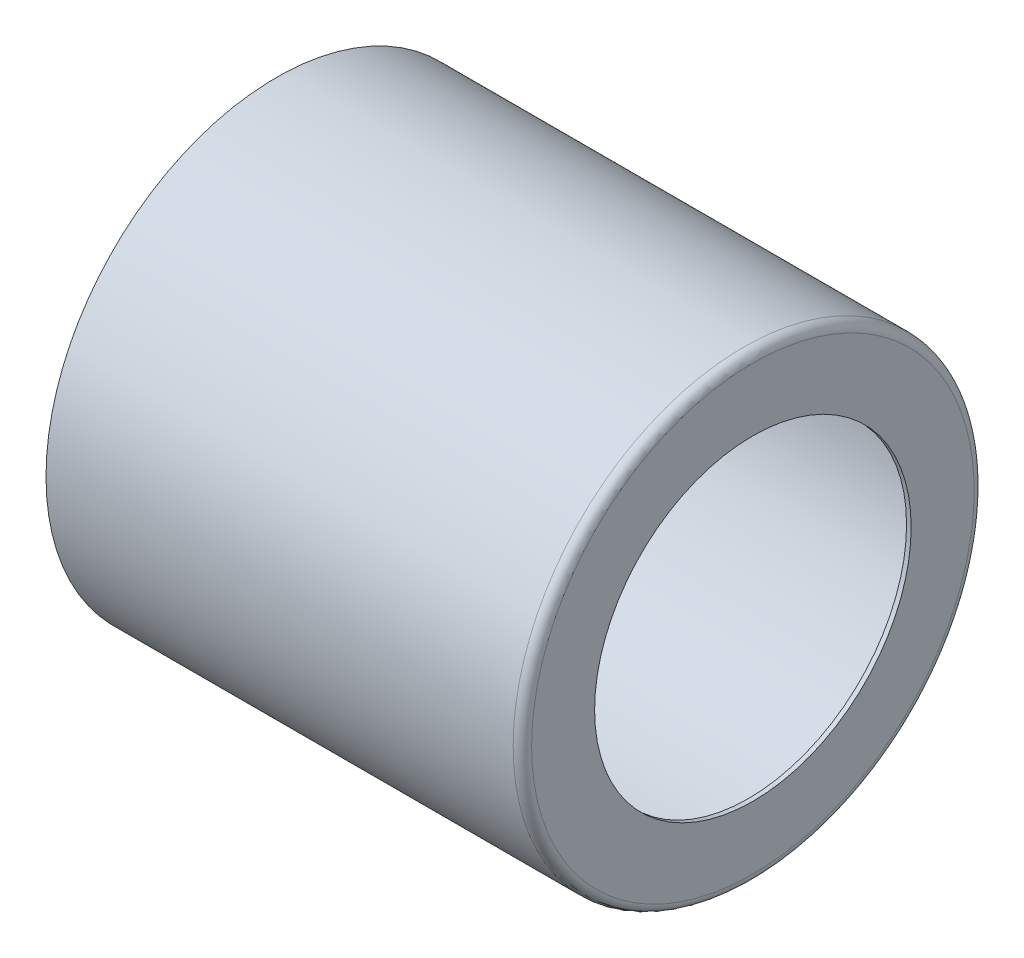
ISO-10303-21;
HEADER;
FILE_DESCRIPTION(('STEP AP214'),'2;1');
FILE_NAME('part.step','',(''),(''),'','','');
FILE_SCHEMA(('AUTOMOTIVE_DESIGN { 1 0 10303 214 1 1 1 1 }'));
ENDSEC;
DATA;
#1=APPLICATION_CONTEXT('core data for automotive mechanical design processes');
#2=APPLICATION_PROTOCOL_DEFINITION('international standard','automotive_design',2000,#1);
#3=PRODUCT_CONTEXT('',#1,'mechanical');
#4=PRODUCT('Part','Part','',(#3));
#5=PRODUCT_RELATED_PRODUCT_CATEGORY('part','',(#4));
#6=PRODUCT_DEFINITION_FORMATION('','',#4);
#7=PRODUCT_DEFINITION_CONTEXT('part definition',#1,'design');
#8=PRODUCT_DEFINITION('design','',#6,#7);
#9=PRODUCT_DEFINITION_SHAPE('','',#8);
#10=(LENGTH_UNIT() NAMED_UNIT(*) SI_UNIT(.MILLI.,.METRE.));
#11=(NAMED_UNIT(*) PLANE_ANGLE_UNIT() SI_UNIT($,.RADIAN.));
#12=(NAMED_UNIT(*) SI_UNIT($,.STERADIAN.) SOLID_ANGLE_UNIT());
#13=UNCERTAINTY_MEASURE_WITH_UNIT(LENGTH_MEASURE(1.E-05),#10,'distance_accuracy_value','');
#14=(GEOMETRIC_REPRESENTATION_CONTEXT(3) GLOBAL_UNCERTAINTY_ASSIGNED_CONTEXT((#13)) GLOBAL_UNIT_ASSIGNED_CONTEXT((#10,
#11,#12)) REPRESENTATION_CONTEXT('',''));
#15=CARTESIAN_POINT('',(0.,0.,0.));
#16=DIRECTION('',(0.,0.,1.));
#17=DIRECTION('',(1.,0.,0.));
#18=AXIS2_PLACEMENT_3D('',#15,#16,#17);
#19=CARTESIAN_POINT('',(0.,75.,0.));
#20=DIRECTION('',(1.,0.,0.));
#21=DIRECTION('',(0.,0.,-1.));
#22=AXIS2_PLACEMENT_3D('',#19,#20,#21);
#23=PLANE('',#22);
#24=CARTESIAN_POINT('',(0.,0.,0.));
#25=DIRECTION('',(-1.,0.,0.));
#26=DIRECTION('',(0.,0.,1.));
#27=AXIS2_PLACEMENT_3D('',#24,#25,#26);
#28=CIRCLE('',#27,73.5);
#29=CARTESIAN_POINT('',(0.,0.,73.5));
#30=VERTEX_POINT('',#29);
#31=EDGE_CURVE('E72',#30,#30,#28,.T.);
#32=ORIENTED_EDGE('',*,*,#31,.F.);
#33=EDGE_LOOP('',(#32));
#34=FACE_BOUND('',#33,.T.);
#35=CARTESIAN_POINT('',(0.,0.,0.));
#36=DIRECTION('',(-1.,0.,0.));
#37=DIRECTION('',(0.,0.,1.));
#38=AXIS2_PLACEMENT_3D('',#35,#36,#37);
#39=CIRCLE('',#38,75.);
#40=CARTESIAN_POINT('',(0.,0.,75.));
#41=VERTEX_POINT('',#40);
#42=EDGE_CURVE('E10',#41,#41,#39,.T.);
#43=ORIENTED_EDGE('',*,*,#42,.T.);
#44=EDGE_LOOP('',(#43));
#45=FACE_BOUND('',#44,.T.);
#46=ADVANCED_FACE('F37',(#34,#45),#23,.F.);
#47=CARTESIAN_POINT('',(-120.01793217917,0.,0.));
#48=DIRECTION('',(-1.,0.,0.));
#49=DIRECTION('',(0.,0.,1.));
#50=AXIS2_PLACEMENT_3D('',#47,#48,#49);
#51=CYLINDRICAL_SURFACE('',#50,75.);
#52=ORIENTED_EDGE('',*,*,#42,.F.);
#53=EDGE_LOOP('',(#52));
#54=FACE_BOUND('',#53,.T.);
#55=CARTESIAN_POINT('',(152.,0.,0.));
#56=DIRECTION('',(-1.,0.,0.));
#57=DIRECTION('',(0.,0.,1.));
#58=AXIS2_PLACEMENT_3D('',#55,#56,#57);
#59=CIRCLE('',#58,75.);
#60=CARTESIAN_POINT('',(152.,0.,75.));
#61=VERTEX_POINT('',#60);
#62=EDGE_CURVE('E44',#61,#61,#59,.T.);
#63=ORIENTED_EDGE('',*,*,#62,.T.);
#64=EDGE_LOOP('',(#63));
#65=FACE_BOUND('',#64,.T.);
#66=ADVANCED_FACE('F80',(#54,#65),#51,.T.);
#67=CARTESIAN_POINT('',(152.,0.,0.));
#68=DIRECTION('',(-1.,0.,0.));
#69=DIRECTION('',(0.,0.,1.));
#70=AXIS2_PLACEMENT_3D('',#67,#68,#69);
#71=TOROIDAL_SURFACE('',#70,72.,3.);
#72=ORIENTED_EDGE('',*,*,#62,.F.);
#73=EDGE_LOOP('',(#72));
#74=FACE_BOUND('',#73,.T.);
#75=CARTESIAN_POINT('',(155.,0.,0.));
#76=DIRECTION('',(-1.,0.,0.));
#77=DIRECTION('',(0.,0.,1.));
#78=AXIS2_PLACEMENT_3D('',#75,#76,#77);
#79=CIRCLE('',#78,72.);
#80=CARTESIAN_POINT('',(155.,0.,72.));
#81=VERTEX_POINT('',#80);
#82=EDGE_CURVE('E49',#81,#81,#79,.T.);
#83=ORIENTED_EDGE('',*,*,#82,.T.);
#84=EDGE_LOOP('',(#83));
#85=FACE_BOUND('',#84,.T.);
#86=ADVANCED_FACE('F84',(#74,#85),#71,.T.);
#87=CARTESIAN_POINT('',(155.,72.,0.));
#88=DIRECTION('',(-1.,0.,0.));
#89=DIRECTION('',(0.,0.,1.));
#90=AXIS2_PLACEMENT_3D('',#87,#88,#89);
#91=PLANE('',#90);
#92=ORIENTED_EDGE('',*,*,#82,.F.);
#93=EDGE_LOOP('',(#92));
#94=FACE_BOUND('',#93,.T.);
#95=CARTESIAN_POINT('',(155.,0.,0.));
#96=DIRECTION('',(-1.,0.,0.));
#97=DIRECTION('',(0.,0.,1.));
#98=AXIS2_PLACEMENT_3D('',#95,#96,#97);
#99=CIRCLE('',#98,51.5);
#100=CARTESIAN_POINT('',(155.,0.,51.5));
#101=VERTEX_POINT('',#100);
#102=EDGE_CURVE('E54',#101,#101,#99,.T.);
#103=ORIENTED_EDGE('',*,*,#102,.T.);
#104=EDGE_LOOP('',(#103));
#105=FACE_BOUND('',#104,.T.);
#106=ADVANCED_FACE('F89',(#94,#105),#91,.F.);
#107=CARTESIAN_POINT('',(-120.01793217917,0.,0.));
#108=DIRECTION('',(-1.,0.,0.));
#109=DIRECTION('',(0.,0.,1.));
#110=AXIS2_PLACEMENT_3D('',#107,#108,#109);
#111=CYLINDRICAL_SURFACE('',#110,51.5);
#112=ORIENTED_EDGE('',*,*,#102,.F.);
#113=EDGE_LOOP('',(#112));
#114=FACE_BOUND('',#113,.T.);
#115=CARTESIAN_POINT('',(153.5,0.,0.));
#116=DIRECTION('',(-1.,0.,0.));
#117=DIRECTION('',(0.,0.,1.));
#118=AXIS2_PLACEMENT_3D('',#115,#116,#117);
#119=CIRCLE('',#118,51.5);
#120=CARTESIAN_POINT('',(153.5,0.,51.5));
#121=VERTEX_POINT('',#120);
#122=EDGE_CURVE('E60',#121,#121,#119,.T.);
#123=ORIENTED_EDGE('',*,*,#122,.T.);
#124=EDGE_LOOP('',(#123));
#125=FACE_BOUND('',#124,.T.);
#126=ADVANCED_FACE('F95',(#114,#125),#111,.F.);
#127=CARTESIAN_POINT('',(153.5,70.5,0.));
#128=DIRECTION('',(1.,0.,0.));
#129=DIRECTION('',(0.,0.,-1.));
#130=AXIS2_PLACEMENT_3D('',#127,#128,#129);
#131=PLANE('',#130);
#132=ORIENTED_EDGE('',*,*,#122,.F.);
#133=EDGE_LOOP('',(#132));
#134=FACE_BOUND('',#133,.T.);
#135=CARTESIAN_POINT('',(153.5,0.,0.));
#136=DIRECTION('',(-1.,0.,0.));
#137=DIRECTION('',(0.,0.,1.));
#138=AXIS2_PLACEMENT_3D('',#135,#136,#137);
#139=CIRCLE('',#138,70.5);
#140=CARTESIAN_POINT('',(153.5,0.,70.5));
#141=VERTEX_POINT('',#140);
#142=EDGE_CURVE('E64',#141,#141,#139,.T.);
#143=ORIENTED_EDGE('',*,*,#142,.T.);
#144=EDGE_LOOP('',(#143));
#145=FACE_BOUND('',#144,.T.);
#146=ADVANCED_FACE('F99',(#134,#145),#131,.F.);
#147=CARTESIAN_POINT('',(150.5,0.,0.));
#148=DIRECTION('',(-1.,0.,0.));
#149=DIRECTION('',(0.,0.,1.));
#150=AXIS2_PLACEMENT_3D('',#147,#148,#149);
#151=TOROIDAL_SURFACE('',#150,70.5,3.);
#152=ORIENTED_EDGE('',*,*,#142,.F.);
#153=EDGE_LOOP('',(#152));
#154=FACE_BOUND('',#153,.T.);
#155=CARTESIAN_POINT('',(150.5,0.,0.));
#156=DIRECTION('',(-1.,0.,0.));
#157=DIRECTION('',(0.,0.,1.));
#158=AXIS2_PLACEMENT_3D('',#155,#156,#157);
#159=CIRCLE('',#158,73.5);
#160=CARTESIAN_POINT('',(150.5,0.,73.5));
#161=VERTEX_POINT('',#160);
#162=EDGE_CURVE('E68',#161,#161,#159,.T.);
#163=ORIENTED_EDGE('',*,*,#162,.T.);
#164=EDGE_LOOP('',(#163));
#165=FACE_BOUND('',#164,.T.);
#166=ADVANCED_FACE('F103',(#154,#165),#151,.F.);
#167=CARTESIAN_POINT('',(-120.01793217917,0.,0.));
#168=DIRECTION('',(-1.,0.,0.));
#169=DIRECTION('',(0.,0.,1.));
#170=AXIS2_PLACEMENT_3D('',#167,#168,#169);
#171=CYLINDRICAL_SURFACE('',#170,73.5);
#172=ORIENTED_EDGE('',*,*,#162,.F.);
#173=EDGE_LOOP('',(#172));
#174=FACE_BOUND('',#173,.T.);
#175=ORIENTED_EDGE('',*,*,#31,.T.);
#176=EDGE_LOOP('',(#175));
#177=FACE_BOUND('',#176,.T.);
#178=ADVANCED_FACE('F77',(#174,#177),#171,.F.);
#179=CLOSED_SHELL('',(#46,#66,#86,#106,#126,#146,#166,#178));
#180=MANIFOLD_SOLID_BREP('B2',#179);
#181=ADVANCED_BREP_SHAPE_REPRESENTATION('',(#18,#180),#14);
#182=SHAPE_DEFINITION_REPRESENTATION(#9,#181);
ENDSEC;
END-ISO-10303-21;
